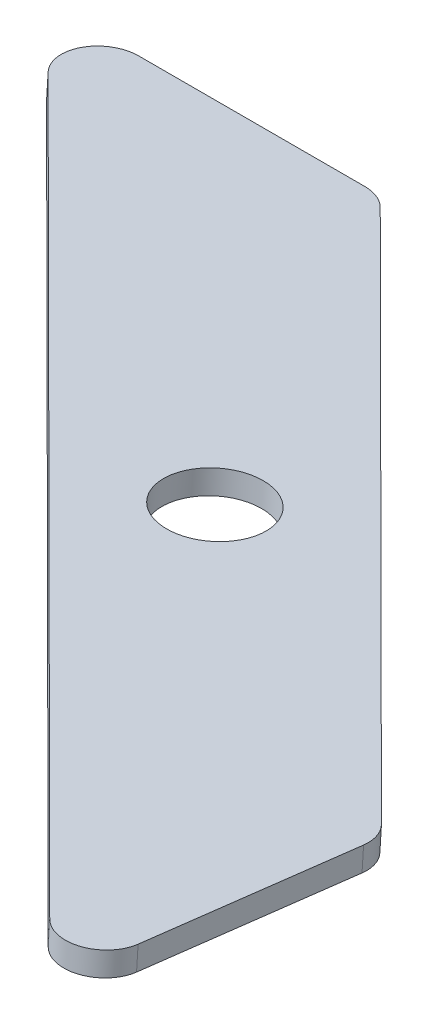
ISO-10303-21;
HEADER;
FILE_DESCRIPTION(('STEP AP214'),'2;1');
FILE_NAME('part.step','',(''),(''),'','','');
FILE_SCHEMA(('AUTOMOTIVE_DESIGN { 1 0 10303 214 1 1 1 1 }'));
ENDSEC;
DATA;
#1=APPLICATION_CONTEXT('core data for automotive mechanical design processes');
#2=APPLICATION_PROTOCOL_DEFINITION('international standard','automotive_design',2000,#1);
#3=PRODUCT_CONTEXT('',#1,'mechanical');
#4=PRODUCT('Part','Part','',(#3));
#5=PRODUCT_RELATED_PRODUCT_CATEGORY('part','',(#4));
#6=PRODUCT_DEFINITION_FORMATION('','',#4);
#7=PRODUCT_DEFINITION_CONTEXT('part definition',#1,'design');
#8=PRODUCT_DEFINITION('design','',#6,#7);
#9=PRODUCT_DEFINITION_SHAPE('','',#8);
#10=(LENGTH_UNIT() NAMED_UNIT(*) SI_UNIT(.MILLI.,.METRE.));
#11=(NAMED_UNIT(*) PLANE_ANGLE_UNIT() SI_UNIT($,.RADIAN.));
#12=(NAMED_UNIT(*) SI_UNIT($,.STERADIAN.) SOLID_ANGLE_UNIT());
#13=UNCERTAINTY_MEASURE_WITH_UNIT(LENGTH_MEASURE(1.E-05),#10,'distance_accuracy_value','');
#14=(GEOMETRIC_REPRESENTATION_CONTEXT(3) GLOBAL_UNCERTAINTY_ASSIGNED_CONTEXT((#13)) GLOBAL_UNIT_ASSIGNED_CONTEXT((#10,
#11,#12)) REPRESENTATION_CONTEXT('',''));
#15=CARTESIAN_POINT('',(0.,0.,0.));
#16=DIRECTION('',(0.,0.,1.));
#17=DIRECTION('',(1.,0.,0.));
#18=AXIS2_PLACEMENT_3D('',#15,#16,#17);
#19=CARTESIAN_POINT('',(-1.78998988288694E-12,39.1342615245883,-2.55582718350751));
#20=DIRECTION('',(0.,0.997874152520213,-0.0651703593059565));
#21=DIRECTION('',(0.,0.0651703593059565,0.997874152520213));
#22=AXIS2_PLACEMENT_3D('',#19,#20,#21);
#23=PLANE('',#22);
#24=DIRECTION('',(0.707106781186551,0.046082402997638,0.705603580017816));
#25=VECTOR('',#24,1.);
#26=CARTESIAN_POINT('',(197.904995267941,101.831170696336,957.445403002554));
#27=LINE('',#26,#25);
#28=CARTESIAN_POINT('',(158.428060449245,99.2584446699023,918.052390126252));
#29=VERTEX_POINT('',#28);
#30=CARTESIAN_POINT('',(197.096018916256,101.778449416827,956.638146411208));
#31=VERTEX_POINT('',#30);
#32=EDGE_CURVE('E142',#29,#31,#27,.T.);
#33=ORIENTED_EDGE('',*,*,#32,.T.);
#34=CARTESIAN_POINT('',(195.299967692043,101.895498720441,958.430379504453));
#35=DIRECTION('',(0.,0.997874152520213,-0.0651703593059565));
#36=DIRECTION('',(0.,0.0651703593059565,0.997874152520213));
#37=AXIS2_PLACEMENT_3D('',#34,#35,#36);
#38=CIRCLE('',#37,2.54);
#39=CARTESIAN_POINT('',(197.835242378415,101.905591138009,958.584912373922));
#40=VERTEX_POINT('',#39);
#41=EDGE_CURVE('E161',#31,#40,#38,.F.);
#42=ORIENTED_EDGE('',*,*,#41,.T.);
#43=DIRECTION('',(-0.0609693238726649,0.0650491189961372,0.99601774766534));
#44=VECTOR('',#43,1.);
#45=CARTESIAN_POINT('',(196.612587776304,103.210060330911,978.558656637692));
#46=LINE('',#45,#44);
#47=CARTESIAN_POINT('',(196.956405284102,102.84323608952,972.941924845815));
#48=VERTEX_POINT('',#47);
#49=EDGE_CURVE('E125',#40,#48,#46,.T.);
#50=ORIENTED_EDGE('',*,*,#49,.T.);
#51=CARTESIAN_POINT('',(194.421130597729,102.833143671951,972.787391976347));
#52=DIRECTION('',(0.,0.997874152520213,-0.0651703593059565));
#53=DIRECTION('',(0.,0.0651703593059565,0.997874152520213));
#54=AXIS2_PLACEMENT_3D('',#51,#52,#53);
#55=CIRCLE('',#54,2.54);
#56=CARTESIAN_POINT('',(192.625079373515,102.950192975565,974.579625069592));
#57=VERTEX_POINT('',#56);
#58=EDGE_CURVE('E156',#48,#57,#55,.F.);
#59=ORIENTED_EDGE('',*,*,#58,.T.);
#60=DIRECTION('',(-0.707106781186551,-0.0460824029976379,-0.705603580017816));
#61=VECTOR('',#60,1.);
#62=CARTESIAN_POINT('',(135.233471370785,99.209961260878,917.310022872096));
#63=LINE('',#62,#61);
#64=CARTESIAN_POINT('',(139.569522594999,99.4925432771293,921.636856312743));
#65=VERTEX_POINT('',#64);
#66=EDGE_CURVE('E172',#57,#65,#63,.T.);
#67=ORIENTED_EDGE('',*,*,#66,.T.);
#68=CARTESIAN_POINT('',(141.365573819213,99.3754939735154,919.844623219498));
#69=DIRECTION('',(0.,0.997874152520213,-0.0651703593059565));
#70=DIRECTION('',(0.,0.0651703593059565,0.997874152520213));
#71=AXIS2_PLACEMENT_3D('',#68,#69,#70);
#72=CIRCLE('',#71,2.54);
#73=CARTESIAN_POINT('',(141.365573819213,99.2099612608783,917.310022872096));
#74=VERTEX_POINT('',#73);
#75=EDGE_CURVE('E61',#65,#74,#72,.F.);
#76=ORIENTED_EDGE('',*,*,#75,.T.);
#77=DIRECTION('',(1.,0.,0.));
#78=VECTOR('',#77,1.);
#79=CARTESIAN_POINT('',(157.684111673458,99.2099612608791,917.310022872096));
#80=LINE('',#79,#78);
#81=CARTESIAN_POINT('',(156.632009225031,99.209961260879,917.310022872096));
#82=VERTEX_POINT('',#81);
#83=EDGE_CURVE('E180',#74,#82,#80,.T.);
#84=ORIENTED_EDGE('',*,*,#83,.T.);
#85=CARTESIAN_POINT('',(156.632009225031,99.3754939735161,919.844623219498));
#86=DIRECTION('',(0.,0.997874152520213,-0.0651703593059565));
#87=DIRECTION('',(0.,0.0651703593059565,0.997874152520213));
#88=AXIS2_PLACEMENT_3D('',#85,#86,#87);
#89=CIRCLE('',#88,2.54);
#90=EDGE_CURVE('E159',#82,#29,#89,.F.);
#91=ORIENTED_EDGE('',*,*,#90,.T.);
#92=EDGE_LOOP('',(#33,#42,#50,#59,#67,#76,#84,#91));
#93=FACE_BOUND('',#92,.T.);
#94=CARTESIAN_POINT('',(171.858791522122,100.865288387251,942.656026346109));
#95=DIRECTION('',(0.,-0.997874152520213,0.065170359305957));
#96=DIRECTION('',(0.,-0.065170359305957,-0.997874152520213));
#97=AXIS2_PLACEMENT_3D('',#94,#95,#96);
#98=CIRCLE('',#97,3.26389999999995);
#99=CARTESIAN_POINT('',(171.858791522122,100.652578851512,939.399064899699));
#100=VERTEX_POINT('',#99);
#101=EDGE_CURVE('E133',#100,#100,#98,.T.);
#102=ORIENTED_EDGE('',*,*,#101,.F.);
#103=EDGE_LOOP('',(#102));
#104=FACE_BOUND('',#103,.T.);
#105=ADVANCED_FACE('F39',(#93,#104),#23,.F.);
#106=CARTESIAN_POINT('',(-1.86257510414061E-12,40.7183867417141,-2.65928512890572));
#107=DIRECTION('',(0.,0.997874152520213,-0.0651703593059565));
#108=DIRECTION('',(0.,0.0651703593059565,0.997874152520213));
#109=AXIS2_PLACEMENT_3D('',#106,#107,#108);
#110=PLANE('',#109);
#111=DIRECTION('',(-0.0609693238726649,0.0650491189961372,0.99601774766534));
#112=VECTOR('',#111,1.);
#113=CARTESIAN_POINT('',(196.612587776304,104.794185548036,978.455198692293));
#114=LINE('',#113,#112);
#115=CARTESIAN_POINT('',(197.835242378415,103.489716355135,958.481454428524));
#116=VERTEX_POINT('',#115);
#117=CARTESIAN_POINT('',(196.956405284102,104.427361306646,972.838466900417));
#118=VERTEX_POINT('',#117);
#119=EDGE_CURVE('E122',#116,#118,#114,.T.);
#120=ORIENTED_EDGE('',*,*,#119,.F.);
#121=CARTESIAN_POINT('',(195.299967692043,103.479623937567,958.326921559055));
#122=DIRECTION('',(0.,0.997874152520213,-0.0651703593059565));
#123=DIRECTION('',(0.,0.0651703593059565,0.997874152520213));
#124=AXIS2_PLACEMENT_3D('',#121,#122,#123);
#125=CIRCLE('',#124,2.54);
#126=CARTESIAN_POINT('',(197.096018916256,103.362574633953,956.53468846581));
#127=VERTEX_POINT('',#126);
#128=EDGE_CURVE('E105',#116,#127,#125,.T.);
#129=ORIENTED_EDGE('',*,*,#128,.T.);
#130=DIRECTION('',(0.707106781186551,0.046082402997638,0.705603580017816));
#131=VECTOR('',#130,1.);
#132=CARTESIAN_POINT('',(197.904995267941,103.415295913462,957.341945057156));
#133=LINE('',#132,#131);
#134=CARTESIAN_POINT('',(158.428060449245,100.842569887028,917.948932180854));
#135=VERTEX_POINT('',#134);
#136=EDGE_CURVE('E146',#135,#127,#133,.T.);
#137=ORIENTED_EDGE('',*,*,#136,.F.);
#138=CARTESIAN_POINT('',(156.632009225031,100.959619190642,919.741165274099));
#139=DIRECTION('',(0.,0.997874152520213,-0.0651703593059565));
#140=DIRECTION('',(0.,0.0651703593059565,0.997874152520213));
#141=AXIS2_PLACEMENT_3D('',#138,#139,#140);
#142=CIRCLE('',#141,2.54);
#143=CARTESIAN_POINT('',(156.632009225031,100.794086478005,917.206564926698));
#144=VERTEX_POINT('',#143);
#145=EDGE_CURVE('E116',#135,#144,#142,.T.);
#146=ORIENTED_EDGE('',*,*,#145,.T.);
#147=DIRECTION('',(1.,0.,0.));
#148=VECTOR('',#147,1.);
#149=CARTESIAN_POINT('',(157.684111673458,100.794086478005,917.206564926698));
#150=LINE('',#149,#148);
#151=CARTESIAN_POINT('',(141.365573819213,100.794086478004,917.206564926698));
#152=VERTEX_POINT('',#151);
#153=EDGE_CURVE('E136',#152,#144,#150,.T.);
#154=ORIENTED_EDGE('',*,*,#153,.F.);
#155=CARTESIAN_POINT('',(141.365573819213,100.959619190641,919.741165274099));
#156=DIRECTION('',(0.,0.997874152520213,-0.0651703593059565));
#157=DIRECTION('',(0.,0.0651703593059565,0.997874152520213));
#158=AXIS2_PLACEMENT_3D('',#155,#156,#157);
#159=CIRCLE('',#158,2.54);
#160=CARTESIAN_POINT('',(139.569522594999,101.076668494255,921.533398367345));
#161=VERTEX_POINT('',#160);
#162=EDGE_CURVE('E150',#152,#161,#159,.T.);
#163=ORIENTED_EDGE('',*,*,#162,.T.);
#164=DIRECTION('',(-0.707106781186551,-0.0460824029976379,-0.705603580017816));
#165=VECTOR('',#164,1.);
#166=CARTESIAN_POINT('',(135.233471370785,100.794086478004,917.206564926698));
#167=LINE('',#166,#165);
#168=CARTESIAN_POINT('',(192.625079373515,104.534318192691,974.476167124194));
#169=VERTEX_POINT('',#168);
#170=EDGE_CURVE('E132',#169,#161,#167,.T.);
#171=ORIENTED_EDGE('',*,*,#170,.F.);
#172=CARTESIAN_POINT('',(194.421130597729,104.417268889077,972.683934030948));
#173=DIRECTION('',(0.,0.997874152520213,-0.0651703593059565));
#174=DIRECTION('',(0.,0.0651703593059565,0.997874152520213));
#175=AXIS2_PLACEMENT_3D('',#172,#173,#174);
#176=CIRCLE('',#175,2.54);
#177=EDGE_CURVE('E126',#169,#118,#176,.T.);
#178=ORIENTED_EDGE('',*,*,#177,.T.);
#179=EDGE_LOOP('',(#120,#129,#137,#146,#154,#163,#171,#178));
#180=FACE_BOUND('',#179,.T.);
#181=CARTESIAN_POINT('',(171.858791522122,102.449413604377,942.552568400711));
#182=DIRECTION('',(0.,-0.997874152520213,0.065170359305957));
#183=DIRECTION('',(0.,-0.065170359305957,-0.997874152520213));
#184=AXIS2_PLACEMENT_3D('',#181,#182,#183);
#185=CIRCLE('',#184,3.26389999999995);
#186=CARTESIAN_POINT('',(171.858791522122,102.236704068638,939.295606954301));
#187=VERTEX_POINT('',#186);
#188=EDGE_CURVE('E139',#187,#187,#185,.T.);
#189=ORIENTED_EDGE('',*,*,#188,.T.);
#190=EDGE_LOOP('',(#189));
#191=FACE_BOUND('',#190,.T.);
#192=ADVANCED_FACE('F129',(#180,#191),#110,.T.);
#193=CARTESIAN_POINT('',(196.612587776304,103.210060330911,978.558656637692));
#194=DIRECTION('',(-0.998139640304156,-0.00397339274346837,-0.0608397123891629));
#195=DIRECTION('',(-0.0608401926589731,0.,0.998147519636861));
#196=AXIS2_PLACEMENT_3D('',#193,#194,#195);
#197=PLANE('',#196);
#198=ORIENTED_EDGE('',*,*,#49,.F.);
#199=DIRECTION('',(0.,0.997874152520213,-0.065170359305957));
#200=VECTOR('',#199,1.);
#201=CARTESIAN_POINT('',(197.835242378415,101.905591138009,958.584912373922));
#202=LINE('',#201,#200);
#203=EDGE_CURVE('E109',#40,#116,#202,.T.);
#204=ORIENTED_EDGE('',*,*,#203,.T.);
#205=ORIENTED_EDGE('',*,*,#119,.T.);
#206=DIRECTION('',(0.,0.997874152520213,-0.065170359305957));
#207=VECTOR('',#206,1.);
#208=CARTESIAN_POINT('',(196.956405284102,102.84323608952,972.941924845815));
#209=LINE('',#208,#207);
#210=EDGE_CURVE('E127',#118,#48,#209,.F.);
#211=ORIENTED_EDGE('',*,*,#210,.T.);
#212=EDGE_LOOP('',(#198,#204,#205,#211));
#213=FACE_BOUND('',#212,.T.);
#214=ADVANCED_FACE('F121',(#213),#197,.F.);
#215=CARTESIAN_POINT('',(135.233471370785,99.209961260878,917.310022872096));
#216=DIRECTION('',(0.707106781186544,-0.046082402997574,-0.705603580017827));
#217=DIRECTION('',(-0.706353980986725,0.,-0.707858780791907));
#218=AXIS2_PLACEMENT_3D('',#215,#216,#217);
#219=PLANE('',#218);
#220=ORIENTED_EDGE('',*,*,#170,.T.);
#221=DIRECTION('',(0.,0.997874152520213,-0.065170359305957));
#222=VECTOR('',#221,1.);
#223=CARTESIAN_POINT('',(139.569522594999,99.4925432771293,921.636856312743));
#224=LINE('',#223,#222);
#225=EDGE_CURVE('E11',#161,#65,#224,.F.);
#226=ORIENTED_EDGE('',*,*,#225,.T.);
#227=ORIENTED_EDGE('',*,*,#66,.F.);
#228=DIRECTION('',(0.,0.997874152520213,-0.065170359305957));
#229=VECTOR('',#228,1.);
#230=CARTESIAN_POINT('',(192.625079373515,102.950192975565,974.579625069592));
#231=LINE('',#230,#229);
#232=EDGE_CURVE('E47',#57,#169,#231,.T.);
#233=ORIENTED_EDGE('',*,*,#232,.T.);
#234=EDGE_LOOP('',(#220,#226,#227,#233));
#235=FACE_BOUND('',#234,.T.);
#236=ADVANCED_FACE('F170',(#235),#219,.F.);
#237=CARTESIAN_POINT('',(157.684111673458,99.2099612608791,917.310022872096));
#238=DIRECTION('',(0.,0.065170359305957,0.997874152520213));
#239=DIRECTION('',(0.,-0.997874152520213,0.065170359305957));
#240=AXIS2_PLACEMENT_3D('',#237,#238,#239);
#241=PLANE('',#240);
#242=ORIENTED_EDGE('',*,*,#153,.T.);
#243=DIRECTION('',(0.,0.997874152520213,-0.065170359305957));
#244=VECTOR('',#243,1.);
#245=CARTESIAN_POINT('',(156.632009225031,99.209961260879,917.310022872096));
#246=LINE('',#245,#244);
#247=EDGE_CURVE('E54',#144,#82,#246,.F.);
#248=ORIENTED_EDGE('',*,*,#247,.T.);
#249=ORIENTED_EDGE('',*,*,#83,.F.);
#250=DIRECTION('',(0.,0.997874152520213,-0.065170359305957));
#251=VECTOR('',#250,1.);
#252=CARTESIAN_POINT('',(141.365573819213,99.2099612608783,917.310022872096));
#253=LINE('',#252,#251);
#254=EDGE_CURVE('E163',#74,#152,#253,.T.);
#255=ORIENTED_EDGE('',*,*,#254,.T.);
#256=EDGE_LOOP('',(#242,#248,#249,#255));
#257=FACE_BOUND('',#256,.T.);
#258=ADVANCED_FACE('F179',(#257),#241,.F.);
#259=CARTESIAN_POINT('',(197.904995267941,101.831170696336,957.445403002554));
#260=DIRECTION('',(-0.707106781186544,0.0460824029975739,0.705603580017827));
#261=DIRECTION('',(0.706353980986724,0.,0.707858780791908));
#262=AXIS2_PLACEMENT_3D('',#259,#260,#261);
#263=PLANE('',#262);
#264=ORIENTED_EDGE('',*,*,#136,.T.);
#265=DIRECTION('',(0.,0.997874152520213,-0.065170359305957));
#266=VECTOR('',#265,1.);
#267=CARTESIAN_POINT('',(197.096018916256,101.778449416827,956.638146411208));
#268=LINE('',#267,#266);
#269=EDGE_CURVE('E110',#127,#31,#268,.F.);
#270=ORIENTED_EDGE('',*,*,#269,.T.);
#271=ORIENTED_EDGE('',*,*,#32,.F.);
#272=DIRECTION('',(0.,0.997874152520213,-0.065170359305957));
#273=VECTOR('',#272,1.);
#274=CARTESIAN_POINT('',(158.428060449245,99.2584446699023,918.052390126252));
#275=LINE('',#274,#273);
#276=EDGE_CURVE('E115',#29,#135,#275,.T.);
#277=ORIENTED_EDGE('',*,*,#276,.T.);
#278=EDGE_LOOP('',(#264,#270,#271,#277));
#279=FACE_BOUND('',#278,.T.);
#280=ADVANCED_FACE('F191',(#279),#263,.F.);
#281=CARTESIAN_POINT('',(171.858791522122,100.865288387251,942.656026346109));
#282=DIRECTION('',(0.,0.997874152520213,-0.065170359305957));
#283=DIRECTION('',(0.,0.065170359305957,0.997874152520213));
#284=AXIS2_PLACEMENT_3D('',#281,#282,#283);
#285=CYLINDRICAL_SURFACE('',#284,3.26389999999995);
#286=ORIENTED_EDGE('',*,*,#101,.T.);
#287=EDGE_LOOP('',(#286));
#288=FACE_BOUND('',#287,.T.);
#289=ORIENTED_EDGE('',*,*,#188,.F.);
#290=EDGE_LOOP('',(#289));
#291=FACE_BOUND('',#290,.T.);
#292=ADVANCED_FACE('F189',(#288,#291),#285,.F.);
#293=CARTESIAN_POINT('',(195.299967692043,101.895498720441,958.430379504453));
#294=DIRECTION('',(0.,0.997874152520212,-0.065170359305957));
#295=DIRECTION('',(0.,0.065170359305957,0.997874152520213));
#296=AXIS2_PLACEMENT_3D('',#293,#294,#295);
#297=CYLINDRICAL_SURFACE('',#296,2.54);
#298=ORIENTED_EDGE('',*,*,#41,.F.);
#299=ORIENTED_EDGE('',*,*,#269,.F.);
#300=ORIENTED_EDGE('',*,*,#128,.F.);
#301=ORIENTED_EDGE('',*,*,#203,.F.);
#302=EDGE_LOOP('',(#298,#299,#300,#301));
#303=FACE_BOUND('',#302,.T.);
#304=ADVANCED_FACE('F108',(#303),#297,.T.);
#305=CARTESIAN_POINT('',(156.632009225031,99.3754939735161,919.844623219498));
#306=DIRECTION('',(0.,0.997874152520212,-0.065170359305957));
#307=DIRECTION('',(0.,0.065170359305957,0.997874152520213));
#308=AXIS2_PLACEMENT_3D('',#305,#306,#307);
#309=CYLINDRICAL_SURFACE('',#308,2.54);
#310=ORIENTED_EDGE('',*,*,#90,.F.);
#311=ORIENTED_EDGE('',*,*,#247,.F.);
#312=ORIENTED_EDGE('',*,*,#145,.F.);
#313=ORIENTED_EDGE('',*,*,#276,.F.);
#314=EDGE_LOOP('',(#310,#311,#312,#313));
#315=FACE_BOUND('',#314,.T.);
#316=ADVANCED_FACE('F198',(#315),#309,.T.);
#317=CARTESIAN_POINT('',(141.365573819213,99.3754939735154,919.844623219498));
#318=DIRECTION('',(0.,0.997874152520212,-0.065170359305957));
#319=DIRECTION('',(0.,0.065170359305957,0.997874152520213));
#320=AXIS2_PLACEMENT_3D('',#317,#318,#319);
#321=CYLINDRICAL_SURFACE('',#320,2.54);
#322=ORIENTED_EDGE('',*,*,#75,.F.);
#323=ORIENTED_EDGE('',*,*,#225,.F.);
#324=ORIENTED_EDGE('',*,*,#162,.F.);
#325=ORIENTED_EDGE('',*,*,#254,.F.);
#326=EDGE_LOOP('',(#322,#323,#324,#325));
#327=FACE_BOUND('',#326,.T.);
#328=ADVANCED_FACE('F178',(#327),#321,.T.);
#329=CARTESIAN_POINT('',(194.421130597729,102.833143671951,972.787391976347));
#330=DIRECTION('',(0.,0.997874152520213,-0.065170359305957));
#331=DIRECTION('',(0.,0.065170359305957,0.997874152520213));
#332=AXIS2_PLACEMENT_3D('',#329,#330,#331);
#333=CYLINDRICAL_SURFACE('',#332,2.54);
#334=ORIENTED_EDGE('',*,*,#58,.F.);
#335=ORIENTED_EDGE('',*,*,#210,.F.);
#336=ORIENTED_EDGE('',*,*,#177,.F.);
#337=ORIENTED_EDGE('',*,*,#232,.F.);
#338=EDGE_LOOP('',(#334,#335,#336,#337));
#339=FACE_BOUND('',#338,.T.);
#340=ADVANCED_FACE('F41',(#339),#333,.T.);
#341=CLOSED_SHELL('',(#105,#192,#214,#236,#258,#280,#292,#304,#316,#328,#340));
#342=MANIFOLD_SOLID_BREP('B2',#341);
#343=ADVANCED_BREP_SHAPE_REPRESENTATION('',(#18,#342),#14);
#344=SHAPE_DEFINITION_REPRESENTATION(#9,#343);
ENDSEC;
END-ISO-10303-21;
